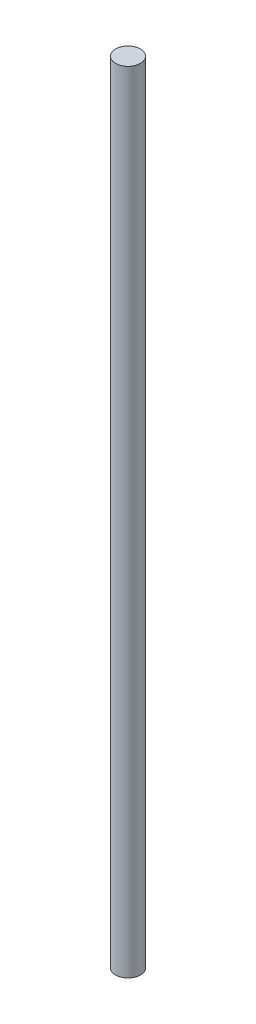
ISO-10303-21;
HEADER;
FILE_DESCRIPTION(('STEP AP214'),'2;1');
FILE_NAME('part.step','',(''),(''),'','','');
FILE_SCHEMA(('AUTOMOTIVE_DESIGN { 1 0 10303 214 1 1 1 1 }'));
ENDSEC;
DATA;
#1=APPLICATION_CONTEXT('core data for automotive mechanical design processes');
#2=APPLICATION_PROTOCOL_DEFINITION('international standard','automotive_design',2000,#1);
#3=PRODUCT_CONTEXT('',#1,'mechanical');
#4=PRODUCT('Part','Part','',(#3));
#5=PRODUCT_RELATED_PRODUCT_CATEGORY('part','',(#4));
#6=PRODUCT_DEFINITION_FORMATION('','',#4);
#7=PRODUCT_DEFINITION_CONTEXT('part definition',#1,'design');
#8=PRODUCT_DEFINITION('design','',#6,#7);
#9=PRODUCT_DEFINITION_SHAPE('','',#8);
#10=(LENGTH_UNIT() NAMED_UNIT(*) SI_UNIT(.MILLI.,.METRE.));
#11=(NAMED_UNIT(*) PLANE_ANGLE_UNIT() SI_UNIT($,.RADIAN.));
#12=(NAMED_UNIT(*) SI_UNIT($,.STERADIAN.) SOLID_ANGLE_UNIT());
#13=UNCERTAINTY_MEASURE_WITH_UNIT(LENGTH_MEASURE(1.E-05),#10,'distance_accuracy_value','');
#14=(GEOMETRIC_REPRESENTATION_CONTEXT(3) GLOBAL_UNCERTAINTY_ASSIGNED_CONTEXT((#13)) GLOBAL_UNIT_ASSIGNED_CONTEXT((#10,
#11,#12)) REPRESENTATION_CONTEXT('',''));
#15=CARTESIAN_POINT('',(0.,0.,0.));
#16=DIRECTION('',(0.,0.,1.));
#17=DIRECTION('',(1.,0.,0.));
#18=AXIS2_PLACEMENT_3D('',#15,#16,#17);
#19=CARTESIAN_POINT('',(0.,95.,0.));
#20=DIRECTION('',(0.,-1.,0.));
#21=DIRECTION('',(0.,0.,-1.));
#22=AXIS2_PLACEMENT_3D('',#19,#20,#21);
#23=CYLINDRICAL_SURFACE('',#22,1.5);
#24=CARTESIAN_POINT('',(0.,95.,0.));
#25=DIRECTION('',(0.,1.,0.));
#26=DIRECTION('',(0.,0.,1.));
#27=AXIS2_PLACEMENT_3D('',#24,#25,#26);
#28=CIRCLE('',#27,1.5);
#29=CARTESIAN_POINT('',(0.,95.,1.5));
#30=VERTEX_POINT('',#29);
#31=EDGE_CURVE('E12',#30,#30,#28,.T.);
#32=ORIENTED_EDGE('',*,*,#31,.F.);
#33=EDGE_LOOP('',(#32));
#34=FACE_BOUND('',#33,.T.);
#35=CARTESIAN_POINT('',(0.,0.,0.));
#36=DIRECTION('',(0.,1.,0.));
#37=DIRECTION('',(0.,0.,1.));
#38=AXIS2_PLACEMENT_3D('',#35,#36,#37);
#39=CIRCLE('',#38,1.5);
#40=CARTESIAN_POINT('',(0.,0.,1.5));
#41=VERTEX_POINT('',#40);
#42=EDGE_CURVE('E44',#41,#41,#39,.T.);
#43=ORIENTED_EDGE('',*,*,#42,.T.);
#44=EDGE_LOOP('',(#43));
#45=FACE_BOUND('',#44,.T.);
#46=ADVANCED_FACE('F41',(#34,#45),#23,.T.);
#47=CARTESIAN_POINT('',(0.,95.,0.));
#48=DIRECTION('',(0.,1.,0.));
#49=DIRECTION('',(0.,0.,1.));
#50=AXIS2_PLACEMENT_3D('',#47,#48,#49);
#51=PLANE('',#50);
#52=ORIENTED_EDGE('',*,*,#31,.T.);
#53=EDGE_LOOP('',(#52));
#54=FACE_BOUND('',#53,.T.);
#55=ADVANCED_FACE('F56',(#54),#51,.T.);
#56=CARTESIAN_POINT('',(0.,0.,0.));
#57=DIRECTION('',(0.,1.,0.));
#58=DIRECTION('',(0.,0.,1.));
#59=AXIS2_PLACEMENT_3D('',#56,#57,#58);
#60=PLANE('',#59);
#61=ORIENTED_EDGE('',*,*,#42,.F.);
#62=EDGE_LOOP('',(#61));
#63=FACE_BOUND('',#62,.T.);
#64=ADVANCED_FACE('F54',(#63),#60,.F.);
#65=CLOSED_SHELL('',(#46,#55,#64));
#66=MANIFOLD_SOLID_BREP('B2',#65);
#67=ADVANCED_BREP_SHAPE_REPRESENTATION('',(#18,#66),#14);
#68=SHAPE_DEFINITION_REPRESENTATION(#9,#67);
ENDSEC;
END-ISO-10303-21;
